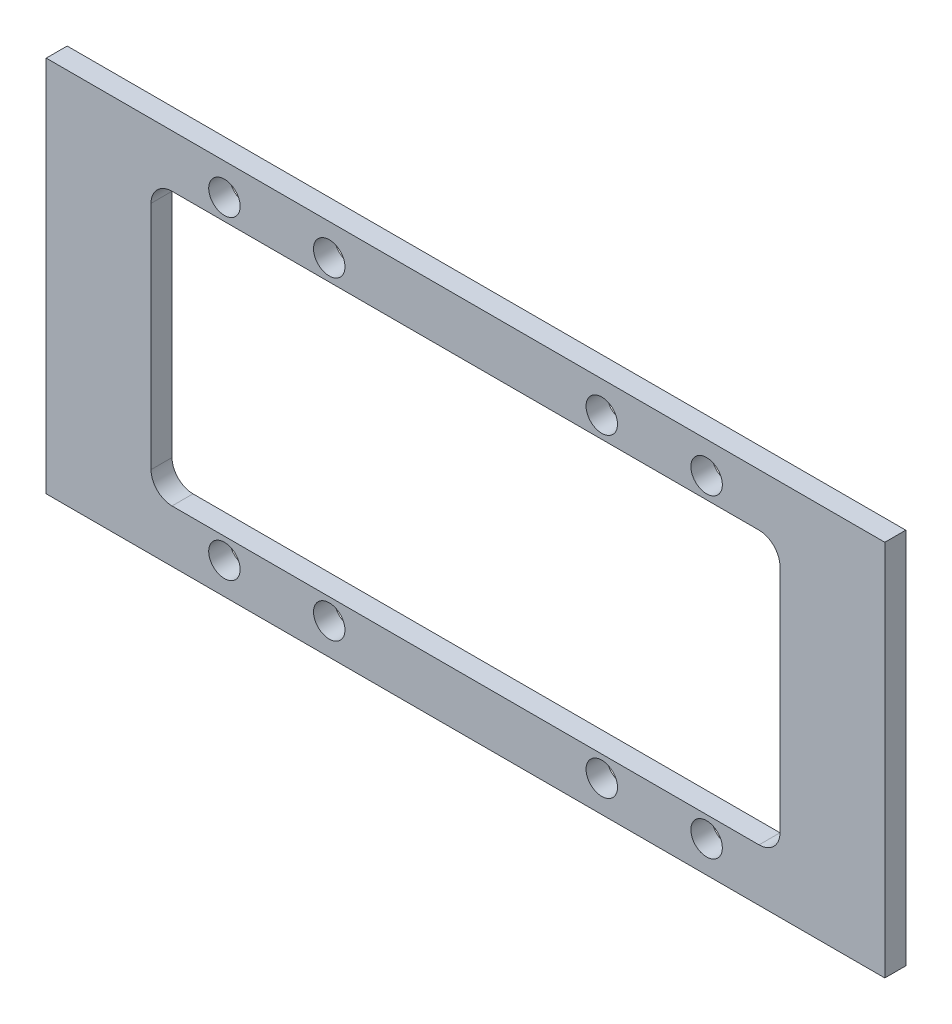
ISO-10303-21;
HEADER;
FILE_DESCRIPTION(('STEP AP214'),'2;1');
FILE_NAME('part.step','',(''),(''),'','','');
FILE_SCHEMA(('AUTOMOTIVE_DESIGN { 1 0 10303 214 1 1 1 1 }'));
ENDSEC;
DATA;
#1=APPLICATION_CONTEXT('core data for automotive mechanical design processes');
#2=APPLICATION_PROTOCOL_DEFINITION('international standard','automotive_design',2000,#1);
#3=PRODUCT_CONTEXT('',#1,'mechanical');
#4=PRODUCT('Part','Part','',(#3));
#5=PRODUCT_RELATED_PRODUCT_CATEGORY('part','',(#4));
#6=PRODUCT_DEFINITION_FORMATION('','',#4);
#7=PRODUCT_DEFINITION_CONTEXT('part definition',#1,'design');
#8=PRODUCT_DEFINITION('design','',#6,#7);
#9=PRODUCT_DEFINITION_SHAPE('','',#8);
#10=(LENGTH_UNIT() NAMED_UNIT(*) SI_UNIT(.MILLI.,.METRE.));
#11=(NAMED_UNIT(*) PLANE_ANGLE_UNIT() SI_UNIT($,.RADIAN.));
#12=(NAMED_UNIT(*) SI_UNIT($,.STERADIAN.) SOLID_ANGLE_UNIT());
#13=UNCERTAINTY_MEASURE_WITH_UNIT(LENGTH_MEASURE(1.E-05),#10,'distance_accuracy_value','');
#14=(GEOMETRIC_REPRESENTATION_CONTEXT(3) GLOBAL_UNCERTAINTY_ASSIGNED_CONTEXT((#13)) GLOBAL_UNIT_ASSIGNED_CONTEXT((#10,
#11,#12)) REPRESENTATION_CONTEXT('',''));
#15=CARTESIAN_POINT('',(0.,0.,0.));
#16=DIRECTION('',(0.,0.,1.));
#17=DIRECTION('',(1.,0.,0.));
#18=AXIS2_PLACEMENT_3D('',#15,#16,#17);
#19=CARTESIAN_POINT('',(40.,18.,2.));
#20=DIRECTION('',(-1.,0.,0.));
#21=DIRECTION('',(0.,-1.,0.));
#22=AXIS2_PLACEMENT_3D('',#19,#20,#21);
#23=PLANE('',#22);
#24=DIRECTION('',(0.,1.,0.));
#25=VECTOR('',#24,1.);
#26=CARTESIAN_POINT('',(40.,18.,0.));
#27=LINE('',#26,#25);
#28=CARTESIAN_POINT('',(40.,-18.,0.));
#29=VERTEX_POINT('',#28);
#30=CARTESIAN_POINT('',(40.,18.,0.));
#31=VERTEX_POINT('',#30);
#32=EDGE_CURVE('E154',#29,#31,#27,.T.);
#33=ORIENTED_EDGE('',*,*,#32,.T.);
#34=DIRECTION('',(0.,0.,-1.));
#35=VECTOR('',#34,1.);
#36=CARTESIAN_POINT('',(40.,18.,2.));
#37=LINE('',#36,#35);
#38=CARTESIAN_POINT('',(40.,18.,2.));
#39=VERTEX_POINT('',#38);
#40=EDGE_CURVE('E135',#39,#31,#37,.T.);
#41=ORIENTED_EDGE('',*,*,#40,.F.);
#42=DIRECTION('',(0.,1.,0.));
#43=VECTOR('',#42,1.);
#44=CARTESIAN_POINT('',(40.,18.,2.));
#45=LINE('',#44,#43);
#46=CARTESIAN_POINT('',(40.,-18.,2.));
#47=VERTEX_POINT('',#46);
#48=EDGE_CURVE('E142',#47,#39,#45,.T.);
#49=ORIENTED_EDGE('',*,*,#48,.F.);
#50=DIRECTION('',(0.,0.,-1.));
#51=VECTOR('',#50,1.);
#52=CARTESIAN_POINT('',(40.,-18.,2.));
#53=LINE('',#52,#51);
#54=EDGE_CURVE('E231',#47,#29,#53,.T.);
#55=ORIENTED_EDGE('',*,*,#54,.T.);
#56=EDGE_LOOP('',(#33,#41,#49,#55));
#57=FACE_BOUND('',#56,.T.);
#58=ADVANCED_FACE('F41',(#57),#23,.F.);
#59=CARTESIAN_POINT('',(-40.,18.,2.));
#60=DIRECTION('',(0.,-1.,0.));
#61=DIRECTION('',(0.,0.,-1.));
#62=AXIS2_PLACEMENT_3D('',#59,#60,#61);
#63=PLANE('',#62);
#64=DIRECTION('',(-1.,0.,0.));
#65=VECTOR('',#64,1.);
#66=CARTESIAN_POINT('',(-40.,18.,0.));
#67=LINE('',#66,#65);
#68=CARTESIAN_POINT('',(-40.,18.,0.));
#69=VERTEX_POINT('',#68);
#70=EDGE_CURVE('E233',#31,#69,#67,.T.);
#71=ORIENTED_EDGE('',*,*,#70,.T.);
#72=DIRECTION('',(0.,0.,-1.));
#73=VECTOR('',#72,1.);
#74=CARTESIAN_POINT('',(-40.,18.,2.));
#75=LINE('',#74,#73);
#76=CARTESIAN_POINT('',(-40.,18.,2.));
#77=VERTEX_POINT('',#76);
#78=EDGE_CURVE('E138',#77,#69,#75,.T.);
#79=ORIENTED_EDGE('',*,*,#78,.F.);
#80=DIRECTION('',(-1.,0.,0.));
#81=VECTOR('',#80,1.);
#82=CARTESIAN_POINT('',(-40.,18.,2.));
#83=LINE('',#82,#81);
#84=EDGE_CURVE('E131',#39,#77,#83,.T.);
#85=ORIENTED_EDGE('',*,*,#84,.F.);
#86=ORIENTED_EDGE('',*,*,#40,.T.);
#87=EDGE_LOOP('',(#71,#79,#85,#86));
#88=FACE_BOUND('',#87,.T.);
#89=ADVANCED_FACE('F133',(#88),#63,.F.);
#90=CARTESIAN_POINT('',(-40.,18.,2.));
#91=DIRECTION('',(1.,0.,0.));
#92=DIRECTION('',(0.,1.,0.));
#93=AXIS2_PLACEMENT_3D('',#90,#91,#92);
#94=PLANE('',#93);
#95=DIRECTION('',(0.,-1.,0.));
#96=VECTOR('',#95,1.);
#97=CARTESIAN_POINT('',(-40.,18.,0.));
#98=LINE('',#97,#96);
#99=CARTESIAN_POINT('',(-40.,-18.,0.));
#100=VERTEX_POINT('',#99);
#101=EDGE_CURVE('E235',#69,#100,#98,.T.);
#102=ORIENTED_EDGE('',*,*,#101,.T.);
#103=DIRECTION('',(0.,0.,-1.));
#104=VECTOR('',#103,1.);
#105=CARTESIAN_POINT('',(-40.,-18.,2.));
#106=LINE('',#105,#104);
#107=CARTESIAN_POINT('',(-40.,-18.,2.));
#108=VERTEX_POINT('',#107);
#109=EDGE_CURVE('E159',#108,#100,#106,.T.);
#110=ORIENTED_EDGE('',*,*,#109,.F.);
#111=DIRECTION('',(0.,-1.,0.));
#112=VECTOR('',#111,1.);
#113=CARTESIAN_POINT('',(-40.,18.,2.));
#114=LINE('',#113,#112);
#115=EDGE_CURVE('E141',#77,#108,#114,.T.);
#116=ORIENTED_EDGE('',*,*,#115,.F.);
#117=ORIENTED_EDGE('',*,*,#78,.T.);
#118=EDGE_LOOP('',(#102,#110,#116,#117));
#119=FACE_BOUND('',#118,.T.);
#120=ADVANCED_FACE('F245',(#119),#94,.F.);
#121=CARTESIAN_POINT('',(-40.,-18.,2.));
#122=DIRECTION('',(0.,1.,0.));
#123=DIRECTION('',(0.,0.,1.));
#124=AXIS2_PLACEMENT_3D('',#121,#122,#123);
#125=PLANE('',#124);
#126=DIRECTION('',(1.,0.,0.));
#127=VECTOR('',#126,1.);
#128=CARTESIAN_POINT('',(-40.,-18.,0.));
#129=LINE('',#128,#127);
#130=EDGE_CURVE('E151',#100,#29,#129,.T.);
#131=ORIENTED_EDGE('',*,*,#130,.T.);
#132=ORIENTED_EDGE('',*,*,#54,.F.);
#133=DIRECTION('',(1.,0.,0.));
#134=VECTOR('',#133,1.);
#135=CARTESIAN_POINT('',(-40.,-18.,2.));
#136=LINE('',#135,#134);
#137=EDGE_CURVE('E147',#108,#47,#136,.T.);
#138=ORIENTED_EDGE('',*,*,#137,.F.);
#139=ORIENTED_EDGE('',*,*,#109,.T.);
#140=EDGE_LOOP('',(#131,#132,#138,#139));
#141=FACE_BOUND('',#140,.T.);
#142=ADVANCED_FACE('F242',(#141),#125,.F.);
#143=CARTESIAN_POINT('',(0.,0.,2.));
#144=DIRECTION('',(0.,0.,1.));
#145=DIRECTION('',(1.,0.,0.));
#146=AXIS2_PLACEMENT_3D('',#143,#144,#145);
#147=PLANE('',#146);
#148=CARTESIAN_POINT('',(23.0000000000005,15.0000000000001,2.));
#149=DIRECTION('',(0.,0.,1.));
#150=DIRECTION('',(1.,0.,0.));
#151=AXIS2_PLACEMENT_3D('',#148,#149,#150);
#152=CIRCLE('',#151,1.5);
#153=CARTESIAN_POINT('',(24.5000000000005,15.0000000000001,2.));
#154=VERTEX_POINT('',#153);
#155=EDGE_CURVE('E350',#154,#154,#152,.T.);
#156=ORIENTED_EDGE('',*,*,#155,.F.);
#157=EDGE_LOOP('',(#156));
#158=FACE_BOUND('',#157,.T.);
#159=CARTESIAN_POINT('',(-22.9999999999994,-15.0000000000005,2.));
#160=DIRECTION('',(0.,0.,1.));
#161=DIRECTION('',(1.,0.,0.));
#162=AXIS2_PLACEMENT_3D('',#159,#160,#161);
#163=CIRCLE('',#162,1.5);
#164=CARTESIAN_POINT('',(-21.4999999999994,-15.0000000000005,2.));
#165=VERTEX_POINT('',#164);
#166=EDGE_CURVE('E343',#165,#165,#163,.T.);
#167=ORIENTED_EDGE('',*,*,#166,.F.);
#168=EDGE_LOOP('',(#167));
#169=FACE_BOUND('',#168,.T.);
#170=CARTESIAN_POINT('',(-12.9999999999994,-15.0000000000005,2.));
#171=DIRECTION('',(0.,0.,1.));
#172=DIRECTION('',(1.,0.,0.));
#173=AXIS2_PLACEMENT_3D('',#170,#171,#172);
#174=CIRCLE('',#173,1.5);
#175=CARTESIAN_POINT('',(-11.4999999999994,-15.0000000000005,2.));
#176=VERTEX_POINT('',#175);
#177=EDGE_CURVE('E342',#176,#176,#174,.T.);
#178=ORIENTED_EDGE('',*,*,#177,.F.);
#179=EDGE_LOOP('',(#178));
#180=FACE_BOUND('',#179,.T.);
#181=CARTESIAN_POINT('',(13.0000000000005,-15.0000000000005,2.));
#182=DIRECTION('',(0.,0.,1.));
#183=DIRECTION('',(1.,0.,0.));
#184=AXIS2_PLACEMENT_3D('',#181,#182,#183);
#185=CIRCLE('',#184,1.5);
#186=CARTESIAN_POINT('',(14.5000000000005,-15.0000000000005,2.));
#187=VERTEX_POINT('',#186);
#188=EDGE_CURVE('E339',#187,#187,#185,.T.);
#189=ORIENTED_EDGE('',*,*,#188,.F.);
#190=EDGE_LOOP('',(#189));
#191=FACE_BOUND('',#190,.T.);
#192=CARTESIAN_POINT('',(13.0000000000004,15.0000000000001,2.));
#193=DIRECTION('',(0.,0.,1.));
#194=DIRECTION('',(1.,0.,0.));
#195=AXIS2_PLACEMENT_3D('',#192,#193,#194);
#196=CIRCLE('',#195,1.5);
#197=CARTESIAN_POINT('',(14.5000000000004,15.0000000000001,2.));
#198=VERTEX_POINT('',#197);
#199=EDGE_CURVE('E351',#198,#198,#196,.T.);
#200=ORIENTED_EDGE('',*,*,#199,.F.);
#201=EDGE_LOOP('',(#200));
#202=FACE_BOUND('',#201,.T.);
#203=CARTESIAN_POINT('',(-12.9999999999994,15.0000000000001,2.));
#204=DIRECTION('',(0.,0.,1.));
#205=DIRECTION('',(1.,0.,0.));
#206=AXIS2_PLACEMENT_3D('',#203,#204,#205);
#207=CIRCLE('',#206,1.5);
#208=CARTESIAN_POINT('',(-11.4999999999994,15.0000000000001,2.));
#209=VERTEX_POINT('',#208);
#210=EDGE_CURVE('E362',#209,#209,#207,.T.);
#211=ORIENTED_EDGE('',*,*,#210,.F.);
#212=EDGE_LOOP('',(#211));
#213=FACE_BOUND('',#212,.T.);
#214=CARTESIAN_POINT('',(-22.9999999999994,15.0000000000001,2.));
#215=DIRECTION('',(0.,0.,1.));
#216=DIRECTION('',(1.,0.,0.));
#217=AXIS2_PLACEMENT_3D('',#214,#215,#216);
#218=CIRCLE('',#217,1.5);
#219=CARTESIAN_POINT('',(-21.4999999999994,15.0000000000001,2.));
#220=VERTEX_POINT('',#219);
#221=EDGE_CURVE('E358',#220,#220,#218,.T.);
#222=ORIENTED_EDGE('',*,*,#221,.F.);
#223=EDGE_LOOP('',(#222));
#224=FACE_BOUND('',#223,.T.);
#225=CARTESIAN_POINT('',(23.0000000000005,-15.0000000000005,2.));
#226=DIRECTION('',(0.,0.,1.));
#227=DIRECTION('',(1.,0.,0.));
#228=AXIS2_PLACEMENT_3D('',#225,#226,#227);
#229=CIRCLE('',#228,1.5);
#230=CARTESIAN_POINT('',(24.5000000000005,-15.0000000000005,2.));
#231=VERTEX_POINT('',#230);
#232=EDGE_CURVE('E336',#231,#231,#229,.T.);
#233=ORIENTED_EDGE('',*,*,#232,.F.);
#234=EDGE_LOOP('',(#233));
#235=FACE_BOUND('',#234,.T.);
#236=DIRECTION('',(1.,0.,0.));
#237=VECTOR('',#236,1.);
#238=CARTESIAN_POINT('',(-30.,-13.,2.));
#239=LINE('',#238,#237);
#240=CARTESIAN_POINT('',(-28.,-13.,2.));
#241=VERTEX_POINT('',#240);
#242=CARTESIAN_POINT('',(28.,-13.,2.));
#243=VERTEX_POINT('',#242);
#244=EDGE_CURVE('E218',#241,#243,#239,.T.);
#245=ORIENTED_EDGE('',*,*,#244,.F.);
#246=CARTESIAN_POINT('',(-28.,-11.,2.));
#247=DIRECTION('',(0.,0.,1.));
#248=DIRECTION('',(1.,0.,0.));
#249=AXIS2_PLACEMENT_3D('',#246,#247,#248);
#250=CIRCLE('',#249,2.);
#251=CARTESIAN_POINT('',(-30.,-11.,2.));
#252=VERTEX_POINT('',#251);
#253=EDGE_CURVE('E183',#241,#252,#250,.F.);
#254=ORIENTED_EDGE('',*,*,#253,.T.);
#255=DIRECTION('',(0.,-1.,0.));
#256=VECTOR('',#255,1.);
#257=CARTESIAN_POINT('',(-30.,-8.,2.));
#258=LINE('',#257,#256);
#259=CARTESIAN_POINT('',(-30.,11.,2.));
#260=VERTEX_POINT('',#259);
#261=EDGE_CURVE('E224',#260,#252,#258,.T.);
#262=ORIENTED_EDGE('',*,*,#261,.F.);
#263=CARTESIAN_POINT('',(-28.,11.,2.));
#264=DIRECTION('',(0.,0.,1.));
#265=DIRECTION('',(1.,0.,0.));
#266=AXIS2_PLACEMENT_3D('',#263,#264,#265);
#267=CIRCLE('',#266,2.);
#268=CARTESIAN_POINT('',(-28.,13.,2.));
#269=VERTEX_POINT('',#268);
#270=EDGE_CURVE('E179',#260,#269,#267,.F.);
#271=ORIENTED_EDGE('',*,*,#270,.T.);
#272=DIRECTION('',(-1.,0.,0.));
#273=VECTOR('',#272,1.);
#274=CARTESIAN_POINT('',(-30.,13.,2.));
#275=LINE('',#274,#273);
#276=CARTESIAN_POINT('',(28.,13.,2.));
#277=VERTEX_POINT('',#276);
#278=EDGE_CURVE('E195',#277,#269,#275,.T.);
#279=ORIENTED_EDGE('',*,*,#278,.F.);
#280=CARTESIAN_POINT('',(28.,11.,2.));
#281=DIRECTION('',(0.,0.,1.));
#282=DIRECTION('',(1.,0.,0.));
#283=AXIS2_PLACEMENT_3D('',#280,#281,#282);
#284=CIRCLE('',#283,2.);
#285=CARTESIAN_POINT('',(30.,11.,2.));
#286=VERTEX_POINT('',#285);
#287=EDGE_CURVE('E49',#277,#286,#284,.F.);
#288=ORIENTED_EDGE('',*,*,#287,.T.);
#289=DIRECTION('',(0.,1.,0.));
#290=VECTOR('',#289,1.);
#291=CARTESIAN_POINT('',(30.,13.,2.));
#292=LINE('',#291,#290);
#293=CARTESIAN_POINT('',(30.,-11.,2.));
#294=VERTEX_POINT('',#293);
#295=EDGE_CURVE('E193',#294,#286,#292,.T.);
#296=ORIENTED_EDGE('',*,*,#295,.F.);
#297=CARTESIAN_POINT('',(28.,-11.,2.));
#298=DIRECTION('',(0.,0.,1.));
#299=DIRECTION('',(1.,0.,0.));
#300=AXIS2_PLACEMENT_3D('',#297,#298,#299);
#301=CIRCLE('',#300,2.);
#302=EDGE_CURVE('E187',#294,#243,#301,.F.);
#303=ORIENTED_EDGE('',*,*,#302,.T.);
#304=EDGE_LOOP('',(#245,#254,#262,#271,#279,#288,#296,#303));
#305=FACE_BOUND('',#304,.T.);
#306=ORIENTED_EDGE('',*,*,#48,.T.);
#307=ORIENTED_EDGE('',*,*,#84,.T.);
#308=ORIENTED_EDGE('',*,*,#115,.T.);
#309=ORIENTED_EDGE('',*,*,#137,.T.);
#310=EDGE_LOOP('',(#306,#307,#308,#309));
#311=FACE_BOUND('',#310,.T.);
#312=ADVANCED_FACE('F145',(#158,#169,#180,#191,#202,#213,#224,#235,#305,#311),#147,.T.);
#313=CARTESIAN_POINT('',(0.,0.,0.));
#314=DIRECTION('',(0.,0.,1.));
#315=DIRECTION('',(1.,0.,0.));
#316=AXIS2_PLACEMENT_3D('',#313,#314,#315);
#317=PLANE('',#316);
#318=CARTESIAN_POINT('',(23.0000000000005,15.0000000000001,0.));
#319=DIRECTION('',(0.,0.,1.));
#320=DIRECTION('',(1.,0.,0.));
#321=AXIS2_PLACEMENT_3D('',#318,#319,#320);
#322=CIRCLE('',#321,1.5);
#323=CARTESIAN_POINT('',(24.5000000000005,15.0000000000001,0.));
#324=VERTEX_POINT('',#323);
#325=EDGE_CURVE('E308',#324,#324,#322,.T.);
#326=ORIENTED_EDGE('',*,*,#325,.T.);
#327=EDGE_LOOP('',(#326));
#328=FACE_BOUND('',#327,.T.);
#329=CARTESIAN_POINT('',(-22.9999999999994,-15.0000000000005,0.));
#330=DIRECTION('',(0.,0.,1.));
#331=DIRECTION('',(1.,0.,0.));
#332=AXIS2_PLACEMENT_3D('',#329,#330,#331);
#333=CIRCLE('',#332,1.5);
#334=CARTESIAN_POINT('',(-21.4999999999994,-15.0000000000005,0.));
#335=VERTEX_POINT('',#334);
#336=EDGE_CURVE('E312',#335,#335,#333,.T.);
#337=ORIENTED_EDGE('',*,*,#336,.T.);
#338=EDGE_LOOP('',(#337));
#339=FACE_BOUND('',#338,.T.);
#340=CARTESIAN_POINT('',(-12.9999999999994,-15.0000000000005,0.));
#341=DIRECTION('',(0.,0.,1.));
#342=DIRECTION('',(1.,0.,0.));
#343=AXIS2_PLACEMENT_3D('',#340,#341,#342);
#344=CIRCLE('',#343,1.5);
#345=CARTESIAN_POINT('',(-11.4999999999994,-15.0000000000005,0.));
#346=VERTEX_POINT('',#345);
#347=EDGE_CURVE('E316',#346,#346,#344,.T.);
#348=ORIENTED_EDGE('',*,*,#347,.T.);
#349=EDGE_LOOP('',(#348));
#350=FACE_BOUND('',#349,.T.);
#351=CARTESIAN_POINT('',(13.0000000000005,-15.0000000000005,0.));
#352=DIRECTION('',(0.,0.,1.));
#353=DIRECTION('',(1.,0.,0.));
#354=AXIS2_PLACEMENT_3D('',#351,#352,#353);
#355=CIRCLE('',#354,1.5);
#356=CARTESIAN_POINT('',(14.5000000000005,-15.0000000000005,0.));
#357=VERTEX_POINT('',#356);
#358=EDGE_CURVE('E320',#357,#357,#355,.T.);
#359=ORIENTED_EDGE('',*,*,#358,.T.);
#360=EDGE_LOOP('',(#359));
#361=FACE_BOUND('',#360,.T.);
#362=CARTESIAN_POINT('',(13.0000000000004,15.0000000000001,0.));
#363=DIRECTION('',(0.,0.,1.));
#364=DIRECTION('',(1.,0.,0.));
#365=AXIS2_PLACEMENT_3D('',#362,#363,#364);
#366=CIRCLE('',#365,1.5);
#367=CARTESIAN_POINT('',(14.5000000000004,15.0000000000001,0.));
#368=VERTEX_POINT('',#367);
#369=EDGE_CURVE('E324',#368,#368,#366,.T.);
#370=ORIENTED_EDGE('',*,*,#369,.T.);
#371=EDGE_LOOP('',(#370));
#372=FACE_BOUND('',#371,.T.);
#373=CARTESIAN_POINT('',(-12.9999999999994,15.0000000000001,0.));
#374=DIRECTION('',(0.,0.,1.));
#375=DIRECTION('',(1.,0.,0.));
#376=AXIS2_PLACEMENT_3D('',#373,#374,#375);
#377=CIRCLE('',#376,1.5);
#378=CARTESIAN_POINT('',(-11.4999999999994,15.0000000000001,0.));
#379=VERTEX_POINT('',#378);
#380=EDGE_CURVE('E328',#379,#379,#377,.T.);
#381=ORIENTED_EDGE('',*,*,#380,.T.);
#382=EDGE_LOOP('',(#381));
#383=FACE_BOUND('',#382,.T.);
#384=CARTESIAN_POINT('',(-22.9999999999994,15.0000000000001,0.));
#385=DIRECTION('',(0.,0.,1.));
#386=DIRECTION('',(1.,0.,0.));
#387=AXIS2_PLACEMENT_3D('',#384,#385,#386);
#388=CIRCLE('',#387,1.5);
#389=CARTESIAN_POINT('',(-21.4999999999994,15.0000000000001,0.));
#390=VERTEX_POINT('',#389);
#391=EDGE_CURVE('E332',#390,#390,#388,.T.);
#392=ORIENTED_EDGE('',*,*,#391,.T.);
#393=EDGE_LOOP('',(#392));
#394=FACE_BOUND('',#393,.T.);
#395=CARTESIAN_POINT('',(23.0000000000005,-15.0000000000005,0.));
#396=DIRECTION('',(0.,0.,1.));
#397=DIRECTION('',(1.,0.,0.));
#398=AXIS2_PLACEMENT_3D('',#395,#396,#397);
#399=CIRCLE('',#398,1.5);
#400=CARTESIAN_POINT('',(24.5000000000005,-15.0000000000005,0.));
#401=VERTEX_POINT('',#400);
#402=EDGE_CURVE('E200',#401,#401,#399,.T.);
#403=ORIENTED_EDGE('',*,*,#402,.T.);
#404=EDGE_LOOP('',(#403));
#405=FACE_BOUND('',#404,.T.);
#406=DIRECTION('',(-1.,0.,0.));
#407=VECTOR('',#406,1.);
#408=CARTESIAN_POINT('',(-30.,13.,0.));
#409=LINE('',#408,#407);
#410=CARTESIAN_POINT('',(28.,13.,0.));
#411=VERTEX_POINT('',#410);
#412=CARTESIAN_POINT('',(-28.,13.,0.));
#413=VERTEX_POINT('',#412);
#414=EDGE_CURVE('E207',#411,#413,#409,.T.);
#415=ORIENTED_EDGE('',*,*,#414,.T.);
#416=CARTESIAN_POINT('',(-28.,11.,0.));
#417=DIRECTION('',(0.,0.,1.));
#418=DIRECTION('',(1.,0.,0.));
#419=AXIS2_PLACEMENT_3D('',#416,#417,#418);
#420=CIRCLE('',#419,2.);
#421=CARTESIAN_POINT('',(-30.,11.,0.));
#422=VERTEX_POINT('',#421);
#423=EDGE_CURVE('E181',#413,#422,#420,.T.);
#424=ORIENTED_EDGE('',*,*,#423,.T.);
#425=DIRECTION('',(0.,-1.,0.));
#426=VECTOR('',#425,1.);
#427=CARTESIAN_POINT('',(-30.,8.,0.));
#428=LINE('',#427,#426);
#429=CARTESIAN_POINT('',(-30.,-11.,0.));
#430=VERTEX_POINT('',#429);
#431=EDGE_CURVE('E213',#422,#430,#428,.T.);
#432=ORIENTED_EDGE('',*,*,#431,.T.);
#433=CARTESIAN_POINT('',(-28.,-11.,0.));
#434=DIRECTION('',(0.,0.,1.));
#435=DIRECTION('',(1.,0.,0.));
#436=AXIS2_PLACEMENT_3D('',#433,#434,#435);
#437=CIRCLE('',#436,2.);
#438=CARTESIAN_POINT('',(-28.,-13.,0.));
#439=VERTEX_POINT('',#438);
#440=EDGE_CURVE('E185',#430,#439,#437,.T.);
#441=ORIENTED_EDGE('',*,*,#440,.T.);
#442=DIRECTION('',(1.,0.,0.));
#443=VECTOR('',#442,1.);
#444=CARTESIAN_POINT('',(-30.,-13.,0.));
#445=LINE('',#444,#443);
#446=CARTESIAN_POINT('',(28.,-13.,0.));
#447=VERTEX_POINT('',#446);
#448=EDGE_CURVE('E216',#439,#447,#445,.T.);
#449=ORIENTED_EDGE('',*,*,#448,.T.);
#450=CARTESIAN_POINT('',(28.,-11.,0.));
#451=DIRECTION('',(0.,0.,1.));
#452=DIRECTION('',(1.,0.,0.));
#453=AXIS2_PLACEMENT_3D('',#450,#451,#452);
#454=CIRCLE('',#453,2.);
#455=CARTESIAN_POINT('',(30.,-11.,0.));
#456=VERTEX_POINT('',#455);
#457=EDGE_CURVE('E63',#447,#456,#454,.T.);
#458=ORIENTED_EDGE('',*,*,#457,.T.);
#459=DIRECTION('',(0.,1.,0.));
#460=VECTOR('',#459,1.);
#461=CARTESIAN_POINT('',(30.,-13.,0.));
#462=LINE('',#461,#460);
#463=CARTESIAN_POINT('',(30.,11.,0.));
#464=VERTEX_POINT('',#463);
#465=EDGE_CURVE('E209',#456,#464,#462,.T.);
#466=ORIENTED_EDGE('',*,*,#465,.T.);
#467=CARTESIAN_POINT('',(28.,11.,0.));
#468=DIRECTION('',(0.,0.,1.));
#469=DIRECTION('',(1.,0.,0.));
#470=AXIS2_PLACEMENT_3D('',#467,#468,#469);
#471=CIRCLE('',#470,2.);
#472=EDGE_CURVE('E11',#464,#411,#471,.T.);
#473=ORIENTED_EDGE('',*,*,#472,.T.);
#474=EDGE_LOOP('',(#415,#424,#432,#441,#449,#458,#466,#473));
#475=FACE_BOUND('',#474,.T.);
#476=ORIENTED_EDGE('',*,*,#32,.F.);
#477=ORIENTED_EDGE('',*,*,#130,.F.);
#478=ORIENTED_EDGE('',*,*,#101,.F.);
#479=ORIENTED_EDGE('',*,*,#70,.F.);
#480=EDGE_LOOP('',(#476,#477,#478,#479));
#481=FACE_BOUND('',#480,.T.);
#482=ADVANCED_FACE('F205',(#328,#339,#350,#361,#372,#383,#394,#405,#475,#481),#317,.F.);
#483=CARTESIAN_POINT('',(-30.,-13.,0.));
#484=DIRECTION('',(0.,-1.,0.));
#485=DIRECTION('',(0.,0.,-1.));
#486=AXIS2_PLACEMENT_3D('',#483,#484,#485);
#487=PLANE('',#486);
#488=ORIENTED_EDGE('',*,*,#448,.F.);
#489=DIRECTION('',(0.,0.,1.));
#490=VECTOR('',#489,1.);
#491=CARTESIAN_POINT('',(-28.,-13.,2.));
#492=LINE('',#491,#490);
#493=EDGE_CURVE('E172',#439,#241,#492,.T.);
#494=ORIENTED_EDGE('',*,*,#493,.T.);
#495=ORIENTED_EDGE('',*,*,#244,.T.);
#496=DIRECTION('',(0.,0.,1.));
#497=VECTOR('',#496,1.);
#498=CARTESIAN_POINT('',(28.,-13.,0.));
#499=LINE('',#498,#497);
#500=EDGE_CURVE('E170',#243,#447,#499,.F.);
#501=ORIENTED_EDGE('',*,*,#500,.T.);
#502=EDGE_LOOP('',(#488,#494,#495,#501));
#503=FACE_BOUND('',#502,.T.);
#504=ADVANCED_FACE('F276',(#503),#487,.F.);
#505=CARTESIAN_POINT('',(-30.,-8.,0.));
#506=DIRECTION('',(-1.,0.,0.));
#507=DIRECTION('',(0.,-1.,0.));
#508=AXIS2_PLACEMENT_3D('',#505,#506,#507);
#509=PLANE('',#508);
#510=ORIENTED_EDGE('',*,*,#431,.F.);
#511=DIRECTION('',(0.,0.,1.));
#512=VECTOR('',#511,1.);
#513=CARTESIAN_POINT('',(-30.,11.,2.));
#514=LINE('',#513,#512);
#515=EDGE_CURVE('E157',#422,#260,#514,.T.);
#516=ORIENTED_EDGE('',*,*,#515,.T.);
#517=ORIENTED_EDGE('',*,*,#261,.T.);
#518=DIRECTION('',(0.,0.,1.));
#519=VECTOR('',#518,1.);
#520=CARTESIAN_POINT('',(-30.,-11.,0.));
#521=LINE('',#520,#519);
#522=EDGE_CURVE('E155',#252,#430,#521,.F.);
#523=ORIENTED_EDGE('',*,*,#522,.T.);
#524=EDGE_LOOP('',(#510,#516,#517,#523));
#525=FACE_BOUND('',#524,.T.);
#526=ADVANCED_FACE('F283',(#525),#509,.F.);
#527=CARTESIAN_POINT('',(-30.,13.,0.));
#528=DIRECTION('',(0.,1.,0.));
#529=DIRECTION('',(-1.,0.,0.));
#530=AXIS2_PLACEMENT_3D('',#527,#528,#529);
#531=PLANE('',#530);
#532=ORIENTED_EDGE('',*,*,#278,.T.);
#533=DIRECTION('',(0.,0.,1.));
#534=VECTOR('',#533,1.);
#535=CARTESIAN_POINT('',(-28.,13.,0.));
#536=LINE('',#535,#534);
#537=EDGE_CURVE('E168',#269,#413,#536,.F.);
#538=ORIENTED_EDGE('',*,*,#537,.T.);
#539=ORIENTED_EDGE('',*,*,#414,.F.);
#540=DIRECTION('',(0.,0.,1.));
#541=VECTOR('',#540,1.);
#542=CARTESIAN_POINT('',(28.,13.,2.));
#543=LINE('',#542,#541);
#544=EDGE_CURVE('E165',#411,#277,#543,.T.);
#545=ORIENTED_EDGE('',*,*,#544,.T.);
#546=EDGE_LOOP('',(#532,#538,#539,#545));
#547=FACE_BOUND('',#546,.T.);
#548=ADVANCED_FACE('F211',(#547),#531,.F.);
#549=CARTESIAN_POINT('',(30.,13.,0.));
#550=DIRECTION('',(1.,0.,0.));
#551=DIRECTION('',(0.,0.,-1.));
#552=AXIS2_PLACEMENT_3D('',#549,#550,#551);
#553=PLANE('',#552);
#554=ORIENTED_EDGE('',*,*,#465,.F.);
#555=DIRECTION('',(0.,0.,1.));
#556=VECTOR('',#555,1.);
#557=CARTESIAN_POINT('',(30.,-11.,2.));
#558=LINE('',#557,#556);
#559=EDGE_CURVE('E176',#456,#294,#558,.T.);
#560=ORIENTED_EDGE('',*,*,#559,.T.);
#561=ORIENTED_EDGE('',*,*,#295,.T.);
#562=DIRECTION('',(0.,0.,1.));
#563=VECTOR('',#562,1.);
#564=CARTESIAN_POINT('',(30.,11.,0.));
#565=LINE('',#564,#563);
#566=EDGE_CURVE('E56',#286,#464,#565,.F.);
#567=ORIENTED_EDGE('',*,*,#566,.T.);
#568=EDGE_LOOP('',(#554,#560,#561,#567));
#569=FACE_BOUND('',#568,.T.);
#570=ADVANCED_FACE('F198',(#569),#553,.F.);
#571=CARTESIAN_POINT('',(-28.,11.,0.));
#572=DIRECTION('',(0.,0.,-1.));
#573=DIRECTION('',(-1.,0.,0.));
#574=AXIS2_PLACEMENT_3D('',#571,#572,#573);
#575=CYLINDRICAL_SURFACE('',#574,2.);
#576=ORIENTED_EDGE('',*,*,#423,.F.);
#577=ORIENTED_EDGE('',*,*,#537,.F.);
#578=ORIENTED_EDGE('',*,*,#270,.F.);
#579=ORIENTED_EDGE('',*,*,#515,.F.);
#580=EDGE_LOOP('',(#576,#577,#578,#579));
#581=FACE_BOUND('',#580,.T.);
#582=ADVANCED_FACE('F259',(#581),#575,.F.);
#583=CARTESIAN_POINT('',(-28.,-11.,0.));
#584=DIRECTION('',(0.,0.,-1.));
#585=DIRECTION('',(-1.,0.,0.));
#586=AXIS2_PLACEMENT_3D('',#583,#584,#585);
#587=CYLINDRICAL_SURFACE('',#586,2.);
#588=ORIENTED_EDGE('',*,*,#440,.F.);
#589=ORIENTED_EDGE('',*,*,#522,.F.);
#590=ORIENTED_EDGE('',*,*,#253,.F.);
#591=ORIENTED_EDGE('',*,*,#493,.F.);
#592=EDGE_LOOP('',(#588,#589,#590,#591));
#593=FACE_BOUND('',#592,.T.);
#594=ADVANCED_FACE('F262',(#593),#587,.F.);
#595=CARTESIAN_POINT('',(28.,-11.,0.));
#596=DIRECTION('',(0.,0.,-1.));
#597=DIRECTION('',(-1.,0.,0.));
#598=AXIS2_PLACEMENT_3D('',#595,#596,#597);
#599=CYLINDRICAL_SURFACE('',#598,2.);
#600=ORIENTED_EDGE('',*,*,#457,.F.);
#601=ORIENTED_EDGE('',*,*,#500,.F.);
#602=ORIENTED_EDGE('',*,*,#302,.F.);
#603=ORIENTED_EDGE('',*,*,#559,.F.);
#604=EDGE_LOOP('',(#600,#601,#602,#603));
#605=FACE_BOUND('',#604,.T.);
#606=ADVANCED_FACE('F265',(#605),#599,.F.);
#607=CARTESIAN_POINT('',(28.,11.,0.));
#608=DIRECTION('',(0.,0.,-1.));
#609=DIRECTION('',(-1.,0.,0.));
#610=AXIS2_PLACEMENT_3D('',#607,#608,#609);
#611=CYLINDRICAL_SURFACE('',#610,2.);
#612=ORIENTED_EDGE('',*,*,#472,.F.);
#613=ORIENTED_EDGE('',*,*,#566,.F.);
#614=ORIENTED_EDGE('',*,*,#287,.F.);
#615=ORIENTED_EDGE('',*,*,#544,.F.);
#616=EDGE_LOOP('',(#612,#613,#614,#615));
#617=FACE_BOUND('',#616,.T.);
#618=ADVANCED_FACE('F43',(#617),#611,.F.);
#619=CARTESIAN_POINT('',(23.0000000000005,-15.0000000000005,0.));
#620=DIRECTION('',(0.,0.,1.));
#621=DIRECTION('',(1.,0.,0.));
#622=AXIS2_PLACEMENT_3D('',#619,#620,#621);
#623=CYLINDRICAL_SURFACE('',#622,1.5);
#624=ORIENTED_EDGE('',*,*,#402,.F.);
#625=EDGE_LOOP('',(#624));
#626=FACE_BOUND('',#625,.T.);
#627=ORIENTED_EDGE('',*,*,#232,.T.);
#628=EDGE_LOOP('',(#627));
#629=FACE_BOUND('',#628,.T.);
#630=ADVANCED_FACE('F272',(#626,#629),#623,.F.);
#631=CARTESIAN_POINT('',(-22.9999999999994,15.0000000000001,0.));
#632=DIRECTION('',(0.,0.,1.));
#633=DIRECTION('',(1.,0.,0.));
#634=AXIS2_PLACEMENT_3D('',#631,#632,#633);
#635=CYLINDRICAL_SURFACE('',#634,1.5);
#636=ORIENTED_EDGE('',*,*,#391,.F.);
#637=EDGE_LOOP('',(#636));
#638=FACE_BOUND('',#637,.T.);
#639=ORIENTED_EDGE('',*,*,#221,.T.);
#640=EDGE_LOOP('',(#639));
#641=FACE_BOUND('',#640,.T.);
#642=ADVANCED_FACE('F378',(#638,#641),#635,.F.);
#643=CARTESIAN_POINT('',(-12.9999999999994,15.0000000000001,0.));
#644=DIRECTION('',(0.,0.,1.));
#645=DIRECTION('',(1.,0.,0.));
#646=AXIS2_PLACEMENT_3D('',#643,#644,#645);
#647=CYLINDRICAL_SURFACE('',#646,1.5);
#648=ORIENTED_EDGE('',*,*,#380,.F.);
#649=EDGE_LOOP('',(#648));
#650=FACE_BOUND('',#649,.T.);
#651=ORIENTED_EDGE('',*,*,#210,.T.);
#652=EDGE_LOOP('',(#651));
#653=FACE_BOUND('',#652,.T.);
#654=ADVANCED_FACE('F382',(#650,#653),#647,.F.);
#655=CARTESIAN_POINT('',(13.0000000000004,15.0000000000001,0.));
#656=DIRECTION('',(0.,0.,1.));
#657=DIRECTION('',(1.,0.,0.));
#658=AXIS2_PLACEMENT_3D('',#655,#656,#657);
#659=CYLINDRICAL_SURFACE('',#658,1.5);
#660=ORIENTED_EDGE('',*,*,#369,.F.);
#661=EDGE_LOOP('',(#660));
#662=FACE_BOUND('',#661,.T.);
#663=ORIENTED_EDGE('',*,*,#199,.T.);
#664=EDGE_LOOP('',(#663));
#665=FACE_BOUND('',#664,.T.);
#666=ADVANCED_FACE('F369',(#662,#665),#659,.F.);
#667=CARTESIAN_POINT('',(13.0000000000005,-15.0000000000005,0.));
#668=DIRECTION('',(0.,0.,1.));
#669=DIRECTION('',(1.,0.,0.));
#670=AXIS2_PLACEMENT_3D('',#667,#668,#669);
#671=CYLINDRICAL_SURFACE('',#670,1.5);
#672=ORIENTED_EDGE('',*,*,#358,.F.);
#673=EDGE_LOOP('',(#672));
#674=FACE_BOUND('',#673,.T.);
#675=ORIENTED_EDGE('',*,*,#188,.T.);
#676=EDGE_LOOP('',(#675));
#677=FACE_BOUND('',#676,.T.);
#678=ADVANCED_FACE('F390',(#674,#677),#671,.F.);
#679=CARTESIAN_POINT('',(-12.9999999999994,-15.0000000000005,0.));
#680=DIRECTION('',(0.,0.,1.));
#681=DIRECTION('',(1.,0.,0.));
#682=AXIS2_PLACEMENT_3D('',#679,#680,#681);
#683=CYLINDRICAL_SURFACE('',#682,1.5);
#684=ORIENTED_EDGE('',*,*,#347,.F.);
#685=EDGE_LOOP('',(#684));
#686=FACE_BOUND('',#685,.T.);
#687=ORIENTED_EDGE('',*,*,#177,.T.);
#688=EDGE_LOOP('',(#687));
#689=FACE_BOUND('',#688,.T.);
#690=ADVANCED_FACE('F386',(#686,#689),#683,.F.);
#691=CARTESIAN_POINT('',(-22.9999999999994,-15.0000000000005,0.));
#692=DIRECTION('',(0.,0.,1.));
#693=DIRECTION('',(1.,0.,0.));
#694=AXIS2_PLACEMENT_3D('',#691,#692,#693);
#695=CYLINDRICAL_SURFACE('',#694,1.5);
#696=ORIENTED_EDGE('',*,*,#336,.F.);
#697=EDGE_LOOP('',(#696));
#698=FACE_BOUND('',#697,.T.);
#699=ORIENTED_EDGE('',*,*,#166,.T.);
#700=EDGE_LOOP('',(#699));
#701=FACE_BOUND('',#700,.T.);
#702=ADVANCED_FACE('F389',(#698,#701),#695,.F.);
#703=CARTESIAN_POINT('',(23.0000000000005,15.0000000000001,0.));
#704=DIRECTION('',(0.,0.,1.));
#705=DIRECTION('',(1.,0.,0.));
#706=AXIS2_PLACEMENT_3D('',#703,#704,#705);
#707=CYLINDRICAL_SURFACE('',#706,1.5);
#708=ORIENTED_EDGE('',*,*,#325,.F.);
#709=EDGE_LOOP('',(#708));
#710=FACE_BOUND('',#709,.T.);
#711=ORIENTED_EDGE('',*,*,#155,.T.);
#712=EDGE_LOOP('',(#711));
#713=FACE_BOUND('',#712,.T.);
#714=ADVANCED_FACE('F395',(#710,#713),#707,.F.);
#715=CLOSED_SHELL('',(#58,#89,#120,#142,#312,#482,#504,#526,#548,#570,#582,#594,#606,#618,#630,
#642,#654,#666,#678,#690,#702,#714));
#716=MANIFOLD_SOLID_BREP('B2',#715);
#717=ADVANCED_BREP_SHAPE_REPRESENTATION('',(#18,#716),#14);
#718=SHAPE_DEFINITION_REPRESENTATION(#9,#717);
ENDSEC;
END-ISO-10303-21;
